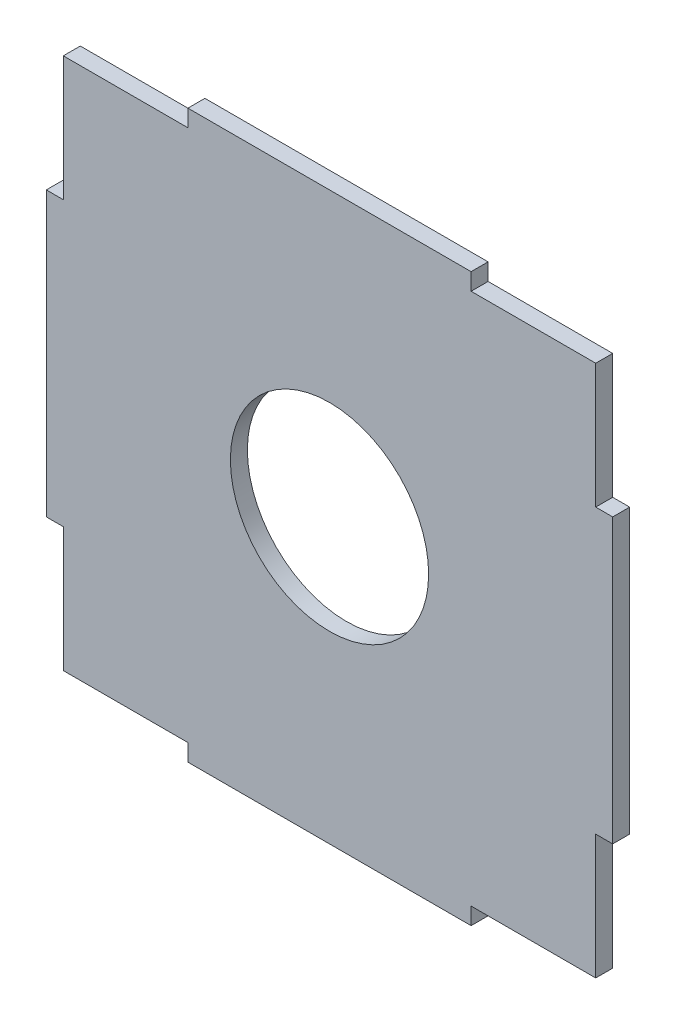
ISO-10303-21;
HEADER;
FILE_DESCRIPTION(('STEP AP214'),'2;1');
FILE_NAME('part.step','',(''),(''),'','','');
FILE_SCHEMA(('AUTOMOTIVE_DESIGN { 1 0 10303 214 1 1 1 1 }'));
ENDSEC;
DATA;
#1=APPLICATION_CONTEXT('core data for automotive mechanical design processes');
#2=APPLICATION_PROTOCOL_DEFINITION('international standard','automotive_design',2000,#1);
#3=PRODUCT_CONTEXT('',#1,'mechanical');
#4=PRODUCT('Part','Part','',(#3));
#5=PRODUCT_RELATED_PRODUCT_CATEGORY('part','',(#4));
#6=PRODUCT_DEFINITION_FORMATION('','',#4);
#7=PRODUCT_DEFINITION_CONTEXT('part definition',#1,'design');
#8=PRODUCT_DEFINITION('design','',#6,#7);
#9=PRODUCT_DEFINITION_SHAPE('','',#8);
#10=(LENGTH_UNIT() NAMED_UNIT(*) SI_UNIT(.MILLI.,.METRE.));
#11=(NAMED_UNIT(*) PLANE_ANGLE_UNIT() SI_UNIT($,.RADIAN.));
#12=(NAMED_UNIT(*) SI_UNIT($,.STERADIAN.) SOLID_ANGLE_UNIT());
#13=UNCERTAINTY_MEASURE_WITH_UNIT(LENGTH_MEASURE(1.E-05),#10,'distance_accuracy_value','');
#14=(GEOMETRIC_REPRESENTATION_CONTEXT(3) GLOBAL_UNCERTAINTY_ASSIGNED_CONTEXT((#13)) GLOBAL_UNIT_ASSIGNED_CONTEXT((#10,
#11,#12)) REPRESENTATION_CONTEXT('',''));
#15=CARTESIAN_POINT('',(0.,0.,0.));
#16=DIRECTION('',(0.,0.,1.));
#17=DIRECTION('',(1.,0.,0.));
#18=AXIS2_PLACEMENT_3D('',#15,#16,#17);
#19=CARTESIAN_POINT('',(-97.,97.,3.));
#20=DIRECTION('',(0.,-1.,0.));
#21=DIRECTION('',(0.,0.,-1.));
#22=AXIS2_PLACEMENT_3D('',#19,#20,#21);
#23=PLANE('',#22);
#24=DIRECTION('',(-1.,0.,0.));
#25=VECTOR('',#24,1.);
#26=CARTESIAN_POINT('',(-97.,97.,0.));
#27=LINE('',#26,#25);
#28=CARTESIAN_POINT('',(-75.,97.,0.));
#29=VERTEX_POINT('',#28);
#30=CARTESIAN_POINT('',(-97.,97.,0.));
#31=VERTEX_POINT('',#30);
#32=EDGE_CURVE('E207',#29,#31,#27,.T.);
#33=ORIENTED_EDGE('',*,*,#32,.T.);
#34=DIRECTION('',(0.,0.,-1.));
#35=VECTOR('',#34,1.);
#36=CARTESIAN_POINT('',(-97.,97.,3.));
#37=LINE('',#36,#35);
#38=CARTESIAN_POINT('',(-97.,97.,3.));
#39=VERTEX_POINT('',#38);
#40=EDGE_CURVE('E11',#39,#31,#37,.T.);
#41=ORIENTED_EDGE('',*,*,#40,.F.);
#42=DIRECTION('',(-1.,0.,0.));
#43=VECTOR('',#42,1.);
#44=CARTESIAN_POINT('',(-97.,97.,3.));
#45=LINE('',#44,#43);
#46=CARTESIAN_POINT('',(-75.,97.,3.));
#47=VERTEX_POINT('',#46);
#48=EDGE_CURVE('E246',#47,#39,#45,.T.);
#49=ORIENTED_EDGE('',*,*,#48,.F.);
#50=DIRECTION('',(0.,0.,-1.));
#51=VECTOR('',#50,1.);
#52=CARTESIAN_POINT('',(-75.,97.,3.));
#53=LINE('',#52,#51);
#54=EDGE_CURVE('E203',#47,#29,#53,.T.);
#55=ORIENTED_EDGE('',*,*,#54,.T.);
#56=EDGE_LOOP('',(#33,#41,#49,#55));
#57=FACE_BOUND('',#56,.T.);
#58=ADVANCED_FACE('F39',(#57),#23,.F.);
#59=CARTESIAN_POINT('',(-97.,97.,3.));
#60=DIRECTION('',(1.,0.,0.));
#61=DIRECTION('',(0.,0.,-1.));
#62=AXIS2_PLACEMENT_3D('',#59,#60,#61);
#63=PLANE('',#62);
#64=DIRECTION('',(0.,-1.,0.));
#65=VECTOR('',#64,1.);
#66=CARTESIAN_POINT('',(-97.,97.,0.));
#67=LINE('',#66,#65);
#68=CARTESIAN_POINT('',(-97.,75.,0.));
#69=VERTEX_POINT('',#68);
#70=EDGE_CURVE('E210',#31,#69,#67,.T.);
#71=ORIENTED_EDGE('',*,*,#70,.T.);
#72=DIRECTION('',(0.,0.,-1.));
#73=VECTOR('',#72,1.);
#74=CARTESIAN_POINT('',(-97.,75.,3.));
#75=LINE('',#74,#73);
#76=CARTESIAN_POINT('',(-97.,75.,3.));
#77=VERTEX_POINT('',#76);
#78=EDGE_CURVE('E47',#77,#69,#75,.T.);
#79=ORIENTED_EDGE('',*,*,#78,.F.);
#80=DIRECTION('',(0.,-1.,0.));
#81=VECTOR('',#80,1.);
#82=CARTESIAN_POINT('',(-97.,97.,3.));
#83=LINE('',#82,#81);
#84=EDGE_CURVE('E134',#39,#77,#83,.T.);
#85=ORIENTED_EDGE('',*,*,#84,.F.);
#86=ORIENTED_EDGE('',*,*,#40,.T.);
#87=EDGE_LOOP('',(#71,#79,#85,#86));
#88=FACE_BOUND('',#87,.T.);
#89=ADVANCED_FACE('F365',(#88),#63,.F.);
#90=CARTESIAN_POINT('',(-100.,75.,3.));
#91=DIRECTION('',(0.,-1.,0.));
#92=DIRECTION('',(0.,0.,-1.));
#93=AXIS2_PLACEMENT_3D('',#90,#91,#92);
#94=PLANE('',#93);
#95=DIRECTION('',(-1.,0.,0.));
#96=VECTOR('',#95,1.);
#97=CARTESIAN_POINT('',(-100.,75.,0.));
#98=LINE('',#97,#96);
#99=CARTESIAN_POINT('',(-100.,75.,0.));
#100=VERTEX_POINT('',#99);
#101=EDGE_CURVE('E213',#69,#100,#98,.T.);
#102=ORIENTED_EDGE('',*,*,#101,.T.);
#103=DIRECTION('',(0.,0.,-1.));
#104=VECTOR('',#103,1.);
#105=CARTESIAN_POINT('',(-100.,75.,3.));
#106=LINE('',#105,#104);
#107=CARTESIAN_POINT('',(-100.,75.,3.));
#108=VERTEX_POINT('',#107);
#109=EDGE_CURVE('E289',#108,#100,#106,.T.);
#110=ORIENTED_EDGE('',*,*,#109,.F.);
#111=DIRECTION('',(-1.,0.,0.));
#112=VECTOR('',#111,1.);
#113=CARTESIAN_POINT('',(-100.,75.,3.));
#114=LINE('',#113,#112);
#115=EDGE_CURVE('E297',#77,#108,#114,.T.);
#116=ORIENTED_EDGE('',*,*,#115,.F.);
#117=ORIENTED_EDGE('',*,*,#78,.T.);
#118=EDGE_LOOP('',(#102,#110,#116,#117));
#119=FACE_BOUND('',#118,.T.);
#120=ADVANCED_FACE('F295',(#119),#94,.F.);
#121=CARTESIAN_POINT('',(-100.,25.,3.));
#122=DIRECTION('',(1.,0.,0.));
#123=DIRECTION('',(0.,0.,-1.));
#124=AXIS2_PLACEMENT_3D('',#121,#122,#123);
#125=PLANE('',#124);
#126=DIRECTION('',(0.,-1.,0.));
#127=VECTOR('',#126,1.);
#128=CARTESIAN_POINT('',(-100.,25.,0.));
#129=LINE('',#128,#127);
#130=CARTESIAN_POINT('',(-100.,25.,0.));
#131=VERTEX_POINT('',#130);
#132=EDGE_CURVE('E215',#100,#131,#129,.T.);
#133=ORIENTED_EDGE('',*,*,#132,.T.);
#134=DIRECTION('',(0.,0.,-1.));
#135=VECTOR('',#134,1.);
#136=CARTESIAN_POINT('',(-100.,25.,3.));
#137=LINE('',#136,#135);
#138=CARTESIAN_POINT('',(-100.,25.,3.));
#139=VERTEX_POINT('',#138);
#140=EDGE_CURVE('E286',#139,#131,#137,.T.);
#141=ORIENTED_EDGE('',*,*,#140,.F.);
#142=DIRECTION('',(0.,-1.,0.));
#143=VECTOR('',#142,1.);
#144=CARTESIAN_POINT('',(-100.,25.,3.));
#145=LINE('',#144,#143);
#146=EDGE_CURVE('E315',#108,#139,#145,.T.);
#147=ORIENTED_EDGE('',*,*,#146,.F.);
#148=ORIENTED_EDGE('',*,*,#109,.T.);
#149=EDGE_LOOP('',(#133,#141,#147,#148));
#150=FACE_BOUND('',#149,.T.);
#151=ADVANCED_FACE('F306',(#150),#125,.F.);
#152=CARTESIAN_POINT('',(-100.,25.,3.));
#153=DIRECTION('',(0.,1.,0.));
#154=DIRECTION('',(-1.,0.,0.));
#155=AXIS2_PLACEMENT_3D('',#152,#153,#154);
#156=PLANE('',#155);
#157=DIRECTION('',(1.,0.,0.));
#158=VECTOR('',#157,1.);
#159=CARTESIAN_POINT('',(-100.,25.,0.));
#160=LINE('',#159,#158);
#161=CARTESIAN_POINT('',(-97.,25.,0.));
#162=VERTEX_POINT('',#161);
#163=EDGE_CURVE('E217',#131,#162,#160,.T.);
#164=ORIENTED_EDGE('',*,*,#163,.T.);
#165=DIRECTION('',(0.,0.,-1.));
#166=VECTOR('',#165,1.);
#167=CARTESIAN_POINT('',(-97.,25.,3.));
#168=LINE('',#167,#166);
#169=CARTESIAN_POINT('',(-97.,25.,3.));
#170=VERTEX_POINT('',#169);
#171=EDGE_CURVE('E283',#170,#162,#168,.T.);
#172=ORIENTED_EDGE('',*,*,#171,.F.);
#173=DIRECTION('',(1.,0.,0.));
#174=VECTOR('',#173,1.);
#175=CARTESIAN_POINT('',(-100.,25.,3.));
#176=LINE('',#175,#174);
#177=EDGE_CURVE('E312',#139,#170,#176,.T.);
#178=ORIENTED_EDGE('',*,*,#177,.F.);
#179=ORIENTED_EDGE('',*,*,#140,.T.);
#180=EDGE_LOOP('',(#164,#172,#178,#179));
#181=FACE_BOUND('',#180,.T.);
#182=ADVANCED_FACE('F310',(#181),#156,.F.);
#183=CARTESIAN_POINT('',(-97.,25.,3.));
#184=DIRECTION('',(1.,0.,0.));
#185=DIRECTION('',(0.,0.,-1.));
#186=AXIS2_PLACEMENT_3D('',#183,#184,#185);
#187=PLANE('',#186);
#188=DIRECTION('',(0.,-1.,0.));
#189=VECTOR('',#188,1.);
#190=CARTESIAN_POINT('',(-97.,25.,0.));
#191=LINE('',#190,#189);
#192=CARTESIAN_POINT('',(-97.,2.99999999999999,0.));
#193=VERTEX_POINT('',#192);
#194=EDGE_CURVE('E219',#162,#193,#191,.T.);
#195=ORIENTED_EDGE('',*,*,#194,.T.);
#196=DIRECTION('',(0.,0.,-1.));
#197=VECTOR('',#196,1.);
#198=CARTESIAN_POINT('',(-97.,2.99999999999999,3.));
#199=LINE('',#198,#197);
#200=CARTESIAN_POINT('',(-97.,2.99999999999999,3.));
#201=VERTEX_POINT('',#200);
#202=EDGE_CURVE('E280',#201,#193,#199,.T.);
#203=ORIENTED_EDGE('',*,*,#202,.F.);
#204=DIRECTION('',(0.,-1.,0.));
#205=VECTOR('',#204,1.);
#206=CARTESIAN_POINT('',(-97.,25.,3.));
#207=LINE('',#206,#205);
#208=EDGE_CURVE('E314',#170,#201,#207,.T.);
#209=ORIENTED_EDGE('',*,*,#208,.F.);
#210=ORIENTED_EDGE('',*,*,#171,.T.);
#211=EDGE_LOOP('',(#195,#203,#209,#210));
#212=FACE_BOUND('',#211,.T.);
#213=ADVANCED_FACE('F378',(#212),#187,.F.);
#214=CARTESIAN_POINT('',(-97.,2.99999999999999,3.));
#215=DIRECTION('',(0.,1.,0.));
#216=DIRECTION('',(-1.,0.,0.));
#217=AXIS2_PLACEMENT_3D('',#214,#215,#216);
#218=PLANE('',#217);
#219=DIRECTION('',(1.,0.,0.));
#220=VECTOR('',#219,1.);
#221=CARTESIAN_POINT('',(-97.,2.99999999999999,0.));
#222=LINE('',#221,#220);
#223=CARTESIAN_POINT('',(-75.,2.99999999999999,0.));
#224=VERTEX_POINT('',#223);
#225=EDGE_CURVE('E221',#193,#224,#222,.T.);
#226=ORIENTED_EDGE('',*,*,#225,.T.);
#227=DIRECTION('',(0.,0.,-1.));
#228=VECTOR('',#227,1.);
#229=CARTESIAN_POINT('',(-75.,2.99999999999999,3.));
#230=LINE('',#229,#228);
#231=CARTESIAN_POINT('',(-75.,2.99999999999999,3.));
#232=VERTEX_POINT('',#231);
#233=EDGE_CURVE('E277',#232,#224,#230,.T.);
#234=ORIENTED_EDGE('',*,*,#233,.F.);
#235=DIRECTION('',(1.,0.,0.));
#236=VECTOR('',#235,1.);
#237=CARTESIAN_POINT('',(-97.,2.99999999999999,3.));
#238=LINE('',#237,#236);
#239=EDGE_CURVE('E317',#201,#232,#238,.T.);
#240=ORIENTED_EDGE('',*,*,#239,.F.);
#241=ORIENTED_EDGE('',*,*,#202,.T.);
#242=EDGE_LOOP('',(#226,#234,#240,#241));
#243=FACE_BOUND('',#242,.T.);
#244=ADVANCED_FACE('F381',(#243),#218,.F.);
#245=CARTESIAN_POINT('',(-75.,2.99999999999999,3.));
#246=DIRECTION('',(1.,0.,0.));
#247=DIRECTION('',(0.,0.,-1.));
#248=AXIS2_PLACEMENT_3D('',#245,#246,#247);
#249=PLANE('',#248);
#250=DIRECTION('',(0.,-1.,0.));
#251=VECTOR('',#250,1.);
#252=CARTESIAN_POINT('',(-75.,2.99999999999999,0.));
#253=LINE('',#252,#251);
#254=CARTESIAN_POINT('',(-75.,0.,0.));
#255=VERTEX_POINT('',#254);
#256=EDGE_CURVE('E223',#224,#255,#253,.T.);
#257=ORIENTED_EDGE('',*,*,#256,.T.);
#258=DIRECTION('',(0.,0.,-1.));
#259=VECTOR('',#258,1.);
#260=CARTESIAN_POINT('',(-75.,0.,3.));
#261=LINE('',#260,#259);
#262=CARTESIAN_POINT('',(-75.,0.,3.));
#263=VERTEX_POINT('',#262);
#264=EDGE_CURVE('E274',#263,#255,#261,.T.);
#265=ORIENTED_EDGE('',*,*,#264,.F.);
#266=DIRECTION('',(0.,-1.,0.));
#267=VECTOR('',#266,1.);
#268=CARTESIAN_POINT('',(-75.,2.99999999999999,3.));
#269=LINE('',#268,#267);
#270=EDGE_CURVE('E323',#232,#263,#269,.T.);
#271=ORIENTED_EDGE('',*,*,#270,.F.);
#272=ORIENTED_EDGE('',*,*,#233,.T.);
#273=EDGE_LOOP('',(#257,#265,#271,#272));
#274=FACE_BOUND('',#273,.T.);
#275=ADVANCED_FACE('F385',(#274),#249,.F.);
#276=CARTESIAN_POINT('',(-25.,0.,3.));
#277=DIRECTION('',(0.,1.,0.));
#278=DIRECTION('',(0.,0.,1.));
#279=AXIS2_PLACEMENT_3D('',#276,#277,#278);
#280=PLANE('',#279);
#281=DIRECTION('',(1.,0.,0.));
#282=VECTOR('',#281,1.);
#283=CARTESIAN_POINT('',(-25.,0.,0.));
#284=LINE('',#283,#282);
#285=CARTESIAN_POINT('',(-25.,0.,0.));
#286=VERTEX_POINT('',#285);
#287=EDGE_CURVE('E225',#255,#286,#284,.T.);
#288=ORIENTED_EDGE('',*,*,#287,.T.);
#289=DIRECTION('',(0.,0.,-1.));
#290=VECTOR('',#289,1.);
#291=CARTESIAN_POINT('',(-25.,0.,3.));
#292=LINE('',#291,#290);
#293=CARTESIAN_POINT('',(-25.,0.,3.));
#294=VERTEX_POINT('',#293);
#295=EDGE_CURVE('E271',#294,#286,#292,.T.);
#296=ORIENTED_EDGE('',*,*,#295,.F.);
#297=DIRECTION('',(1.,0.,0.));
#298=VECTOR('',#297,1.);
#299=CARTESIAN_POINT('',(-25.,0.,3.));
#300=LINE('',#299,#298);
#301=EDGE_CURVE('E325',#263,#294,#300,.T.);
#302=ORIENTED_EDGE('',*,*,#301,.F.);
#303=ORIENTED_EDGE('',*,*,#264,.T.);
#304=EDGE_LOOP('',(#288,#296,#302,#303));
#305=FACE_BOUND('',#304,.T.);
#306=ADVANCED_FACE('F389',(#305),#280,.F.);
#307=CARTESIAN_POINT('',(-25.,2.99999999999999,3.));
#308=DIRECTION('',(-1.,0.,0.));
#309=DIRECTION('',(0.,-1.,0.));
#310=AXIS2_PLACEMENT_3D('',#307,#308,#309);
#311=PLANE('',#310);
#312=DIRECTION('',(0.,1.,0.));
#313=VECTOR('',#312,1.);
#314=CARTESIAN_POINT('',(-25.,2.99999999999999,0.));
#315=LINE('',#314,#313);
#316=CARTESIAN_POINT('',(-25.,2.99999999999999,0.));
#317=VERTEX_POINT('',#316);
#318=EDGE_CURVE('E227',#286,#317,#315,.T.);
#319=ORIENTED_EDGE('',*,*,#318,.T.);
#320=DIRECTION('',(0.,0.,-1.));
#321=VECTOR('',#320,1.);
#322=CARTESIAN_POINT('',(-25.,2.99999999999999,3.));
#323=LINE('',#322,#321);
#324=CARTESIAN_POINT('',(-25.,2.99999999999999,3.));
#325=VERTEX_POINT('',#324);
#326=EDGE_CURVE('E268',#325,#317,#323,.T.);
#327=ORIENTED_EDGE('',*,*,#326,.F.);
#328=DIRECTION('',(0.,1.,0.));
#329=VECTOR('',#328,1.);
#330=CARTESIAN_POINT('',(-25.,2.99999999999999,3.));
#331=LINE('',#330,#329);
#332=EDGE_CURVE('E327',#294,#325,#331,.T.);
#333=ORIENTED_EDGE('',*,*,#332,.F.);
#334=ORIENTED_EDGE('',*,*,#295,.T.);
#335=EDGE_LOOP('',(#319,#327,#333,#334));
#336=FACE_BOUND('',#335,.T.);
#337=ADVANCED_FACE('F393',(#336),#311,.F.);
#338=CARTESIAN_POINT('',(-25.,2.99999999999999,3.));
#339=DIRECTION('',(0.,1.,0.));
#340=DIRECTION('',(-1.,0.,0.));
#341=AXIS2_PLACEMENT_3D('',#338,#339,#340);
#342=PLANE('',#341);
#343=DIRECTION('',(1.,0.,0.));
#344=VECTOR('',#343,1.);
#345=CARTESIAN_POINT('',(-25.,2.99999999999999,0.));
#346=LINE('',#345,#344);
#347=CARTESIAN_POINT('',(-2.99999999999999,2.99999999999999,0.));
#348=VERTEX_POINT('',#347);
#349=EDGE_CURVE('E229',#317,#348,#346,.T.);
#350=ORIENTED_EDGE('',*,*,#349,.T.);
#351=DIRECTION('',(0.,0.,-1.));
#352=VECTOR('',#351,1.);
#353=CARTESIAN_POINT('',(-2.99999999999999,2.99999999999999,3.));
#354=LINE('',#353,#352);
#355=CARTESIAN_POINT('',(-2.99999999999999,2.99999999999999,3.));
#356=VERTEX_POINT('',#355);
#357=EDGE_CURVE('E265',#356,#348,#354,.T.);
#358=ORIENTED_EDGE('',*,*,#357,.F.);
#359=DIRECTION('',(1.,0.,0.));
#360=VECTOR('',#359,1.);
#361=CARTESIAN_POINT('',(-25.,2.99999999999999,3.));
#362=LINE('',#361,#360);
#363=EDGE_CURVE('E329',#325,#356,#362,.T.);
#364=ORIENTED_EDGE('',*,*,#363,.F.);
#365=ORIENTED_EDGE('',*,*,#326,.T.);
#366=EDGE_LOOP('',(#350,#358,#364,#365));
#367=FACE_BOUND('',#366,.T.);
#368=ADVANCED_FACE('F397',(#367),#342,.F.);
#369=CARTESIAN_POINT('',(-2.99999999999999,25.,3.));
#370=DIRECTION('',(-1.,0.,0.));
#371=DIRECTION('',(0.,-1.,0.));
#372=AXIS2_PLACEMENT_3D('',#369,#370,#371);
#373=PLANE('',#372);
#374=DIRECTION('',(0.,1.,0.));
#375=VECTOR('',#374,1.);
#376=CARTESIAN_POINT('',(-2.99999999999999,25.,0.));
#377=LINE('',#376,#375);
#378=CARTESIAN_POINT('',(-2.99999999999999,25.,0.));
#379=VERTEX_POINT('',#378);
#380=EDGE_CURVE('E231',#348,#379,#377,.T.);
#381=ORIENTED_EDGE('',*,*,#380,.T.);
#382=DIRECTION('',(0.,0.,-1.));
#383=VECTOR('',#382,1.);
#384=CARTESIAN_POINT('',(-2.99999999999999,25.,3.));
#385=LINE('',#384,#383);
#386=CARTESIAN_POINT('',(-2.99999999999999,25.,3.));
#387=VERTEX_POINT('',#386);
#388=EDGE_CURVE('E262',#387,#379,#385,.T.);
#389=ORIENTED_EDGE('',*,*,#388,.F.);
#390=DIRECTION('',(0.,1.,0.));
#391=VECTOR('',#390,1.);
#392=CARTESIAN_POINT('',(-2.99999999999999,25.,3.));
#393=LINE('',#392,#391);
#394=EDGE_CURVE('E331',#356,#387,#393,.T.);
#395=ORIENTED_EDGE('',*,*,#394,.F.);
#396=ORIENTED_EDGE('',*,*,#357,.T.);
#397=EDGE_LOOP('',(#381,#389,#395,#396));
#398=FACE_BOUND('',#397,.T.);
#399=ADVANCED_FACE('F401',(#398),#373,.F.);
#400=CARTESIAN_POINT('',(-2.99999999999999,25.,3.));
#401=DIRECTION('',(0.,1.,0.));
#402=DIRECTION('',(-1.,0.,0.));
#403=AXIS2_PLACEMENT_3D('',#400,#401,#402);
#404=PLANE('',#403);
#405=DIRECTION('',(1.,0.,0.));
#406=VECTOR('',#405,1.);
#407=CARTESIAN_POINT('',(-2.99999999999999,25.,0.));
#408=LINE('',#407,#406);
#409=CARTESIAN_POINT('',(0.,25.,0.));
#410=VERTEX_POINT('',#409);
#411=EDGE_CURVE('E233',#379,#410,#408,.T.);
#412=ORIENTED_EDGE('',*,*,#411,.T.);
#413=DIRECTION('',(0.,0.,-1.));
#414=VECTOR('',#413,1.);
#415=CARTESIAN_POINT('',(0.,25.,3.));
#416=LINE('',#415,#414);
#417=CARTESIAN_POINT('',(0.,25.,3.));
#418=VERTEX_POINT('',#417);
#419=EDGE_CURVE('E259',#418,#410,#416,.T.);
#420=ORIENTED_EDGE('',*,*,#419,.F.);
#421=DIRECTION('',(1.,0.,0.));
#422=VECTOR('',#421,1.);
#423=CARTESIAN_POINT('',(-2.99999999999999,25.,3.));
#424=LINE('',#423,#422);
#425=EDGE_CURVE('E333',#387,#418,#424,.T.);
#426=ORIENTED_EDGE('',*,*,#425,.F.);
#427=ORIENTED_EDGE('',*,*,#388,.T.);
#428=EDGE_LOOP('',(#412,#420,#426,#427));
#429=FACE_BOUND('',#428,.T.);
#430=ADVANCED_FACE('F405',(#429),#404,.F.);
#431=CARTESIAN_POINT('',(0.,25.,3.));
#432=DIRECTION('',(-1.,0.,0.));
#433=DIRECTION('',(0.,0.,1.));
#434=AXIS2_PLACEMENT_3D('',#431,#432,#433);
#435=PLANE('',#434);
#436=DIRECTION('',(0.,1.,0.));
#437=VECTOR('',#436,1.);
#438=CARTESIAN_POINT('',(0.,25.,0.));
#439=LINE('',#438,#437);
#440=CARTESIAN_POINT('',(0.,75.,0.));
#441=VERTEX_POINT('',#440);
#442=EDGE_CURVE('E235',#410,#441,#439,.T.);
#443=ORIENTED_EDGE('',*,*,#442,.T.);
#444=DIRECTION('',(0.,0.,-1.));
#445=VECTOR('',#444,1.);
#446=CARTESIAN_POINT('',(0.,75.,3.));
#447=LINE('',#446,#445);
#448=CARTESIAN_POINT('',(0.,75.,3.));
#449=VERTEX_POINT('',#448);
#450=EDGE_CURVE('E256',#449,#441,#447,.T.);
#451=ORIENTED_EDGE('',*,*,#450,.F.);
#452=DIRECTION('',(0.,1.,0.));
#453=VECTOR('',#452,1.);
#454=CARTESIAN_POINT('',(0.,25.,3.));
#455=LINE('',#454,#453);
#456=EDGE_CURVE('E335',#418,#449,#455,.T.);
#457=ORIENTED_EDGE('',*,*,#456,.F.);
#458=ORIENTED_EDGE('',*,*,#419,.T.);
#459=EDGE_LOOP('',(#443,#451,#457,#458));
#460=FACE_BOUND('',#459,.T.);
#461=ADVANCED_FACE('F409',(#460),#435,.F.);
#462=CARTESIAN_POINT('',(-3.,75.,3.));
#463=DIRECTION('',(0.,-1.,0.));
#464=DIRECTION('',(0.,0.,-1.));
#465=AXIS2_PLACEMENT_3D('',#462,#463,#464);
#466=PLANE('',#465);
#467=DIRECTION('',(-1.,0.,0.));
#468=VECTOR('',#467,1.);
#469=CARTESIAN_POINT('',(-3.,75.,0.));
#470=LINE('',#469,#468);
#471=CARTESIAN_POINT('',(-3.,75.,0.));
#472=VERTEX_POINT('',#471);
#473=EDGE_CURVE('E237',#441,#472,#470,.T.);
#474=ORIENTED_EDGE('',*,*,#473,.T.);
#475=DIRECTION('',(0.,0.,-1.));
#476=VECTOR('',#475,1.);
#477=CARTESIAN_POINT('',(-3.,75.,3.));
#478=LINE('',#477,#476);
#479=CARTESIAN_POINT('',(-3.,75.,3.));
#480=VERTEX_POINT('',#479);
#481=EDGE_CURVE('E253',#480,#472,#478,.T.);
#482=ORIENTED_EDGE('',*,*,#481,.F.);
#483=DIRECTION('',(-1.,0.,0.));
#484=VECTOR('',#483,1.);
#485=CARTESIAN_POINT('',(-3.,75.,3.));
#486=LINE('',#485,#484);
#487=EDGE_CURVE('E337',#449,#480,#486,.T.);
#488=ORIENTED_EDGE('',*,*,#487,.F.);
#489=ORIENTED_EDGE('',*,*,#450,.T.);
#490=EDGE_LOOP('',(#474,#482,#488,#489));
#491=FACE_BOUND('',#490,.T.);
#492=ADVANCED_FACE('F413',(#491),#466,.F.);
#493=CARTESIAN_POINT('',(-3.,97.,3.));
#494=DIRECTION('',(-1.,0.,0.));
#495=DIRECTION('',(0.,-1.,0.));
#496=AXIS2_PLACEMENT_3D('',#493,#494,#495);
#497=PLANE('',#496);
#498=DIRECTION('',(0.,1.,0.));
#499=VECTOR('',#498,1.);
#500=CARTESIAN_POINT('',(-3.,97.,0.));
#501=LINE('',#500,#499);
#502=CARTESIAN_POINT('',(-3.,97.,0.));
#503=VERTEX_POINT('',#502);
#504=EDGE_CURVE('E239',#472,#503,#501,.T.);
#505=ORIENTED_EDGE('',*,*,#504,.T.);
#506=DIRECTION('',(0.,0.,-1.));
#507=VECTOR('',#506,1.);
#508=CARTESIAN_POINT('',(-3.,97.,3.));
#509=LINE('',#508,#507);
#510=CARTESIAN_POINT('',(-3.,97.,3.));
#511=VERTEX_POINT('',#510);
#512=EDGE_CURVE('E250',#511,#503,#509,.T.);
#513=ORIENTED_EDGE('',*,*,#512,.F.);
#514=DIRECTION('',(0.,1.,0.));
#515=VECTOR('',#514,1.);
#516=CARTESIAN_POINT('',(-3.,97.,3.));
#517=LINE('',#516,#515);
#518=EDGE_CURVE('E339',#480,#511,#517,.T.);
#519=ORIENTED_EDGE('',*,*,#518,.F.);
#520=ORIENTED_EDGE('',*,*,#481,.T.);
#521=EDGE_LOOP('',(#505,#513,#519,#520));
#522=FACE_BOUND('',#521,.T.);
#523=ADVANCED_FACE('F345',(#522),#497,.F.);
#524=CARTESIAN_POINT('',(-25.,97.,3.));
#525=DIRECTION('',(0.,-1.,0.));
#526=DIRECTION('',(0.,0.,-1.));
#527=AXIS2_PLACEMENT_3D('',#524,#525,#526);
#528=PLANE('',#527);
#529=DIRECTION('',(-1.,0.,0.));
#530=VECTOR('',#529,1.);
#531=CARTESIAN_POINT('',(-25.,97.,0.));
#532=LINE('',#531,#530);
#533=CARTESIAN_POINT('',(-25.,97.,0.));
#534=VERTEX_POINT('',#533);
#535=EDGE_CURVE('E241',#503,#534,#532,.T.);
#536=ORIENTED_EDGE('',*,*,#535,.T.);
#537=DIRECTION('',(0.,0.,-1.));
#538=VECTOR('',#537,1.);
#539=CARTESIAN_POINT('',(-25.,97.,3.));
#540=LINE('',#539,#538);
#541=CARTESIAN_POINT('',(-25.,97.,3.));
#542=VERTEX_POINT('',#541);
#543=EDGE_CURVE('E198',#542,#534,#540,.T.);
#544=ORIENTED_EDGE('',*,*,#543,.F.);
#545=DIRECTION('',(-1.,0.,0.));
#546=VECTOR('',#545,1.);
#547=CARTESIAN_POINT('',(-25.,97.,3.));
#548=LINE('',#547,#546);
#549=EDGE_CURVE('E189',#511,#542,#548,.T.);
#550=ORIENTED_EDGE('',*,*,#549,.F.);
#551=ORIENTED_EDGE('',*,*,#512,.T.);
#552=EDGE_LOOP('',(#536,#544,#550,#551));
#553=FACE_BOUND('',#552,.T.);
#554=ADVANCED_FACE('F349',(#553),#528,.F.);
#555=CARTESIAN_POINT('',(-25.,100.,3.));
#556=DIRECTION('',(-1.,0.,0.));
#557=DIRECTION('',(0.,-1.,0.));
#558=AXIS2_PLACEMENT_3D('',#555,#556,#557);
#559=PLANE('',#558);
#560=DIRECTION('',(0.,1.,0.));
#561=VECTOR('',#560,1.);
#562=CARTESIAN_POINT('',(-25.,100.,0.));
#563=LINE('',#562,#561);
#564=CARTESIAN_POINT('',(-25.,100.,0.));
#565=VERTEX_POINT('',#564);
#566=EDGE_CURVE('E197',#534,#565,#563,.T.);
#567=ORIENTED_EDGE('',*,*,#566,.T.);
#568=DIRECTION('',(0.,0.,-1.));
#569=VECTOR('',#568,1.);
#570=CARTESIAN_POINT('',(-25.,100.,3.));
#571=LINE('',#570,#569);
#572=CARTESIAN_POINT('',(-25.,100.,3.));
#573=VERTEX_POINT('',#572);
#574=EDGE_CURVE('E194',#573,#565,#571,.T.);
#575=ORIENTED_EDGE('',*,*,#574,.F.);
#576=DIRECTION('',(0.,1.,0.));
#577=VECTOR('',#576,1.);
#578=CARTESIAN_POINT('',(-25.,100.,3.));
#579=LINE('',#578,#577);
#580=EDGE_CURVE('E183',#542,#573,#579,.T.);
#581=ORIENTED_EDGE('',*,*,#580,.F.);
#582=ORIENTED_EDGE('',*,*,#543,.T.);
#583=EDGE_LOOP('',(#567,#575,#581,#582));
#584=FACE_BOUND('',#583,.T.);
#585=ADVANCED_FACE('F195',(#584),#559,.F.);
#586=CARTESIAN_POINT('',(-25.,100.,3.));
#587=DIRECTION('',(0.,-1.,0.));
#588=DIRECTION('',(0.,0.,-1.));
#589=AXIS2_PLACEMENT_3D('',#586,#587,#588);
#590=PLANE('',#589);
#591=DIRECTION('',(-1.,0.,0.));
#592=VECTOR('',#591,1.);
#593=CARTESIAN_POINT('',(-25.,100.,0.));
#594=LINE('',#593,#592);
#595=CARTESIAN_POINT('',(-75.,100.,0.));
#596=VERTEX_POINT('',#595);
#597=EDGE_CURVE('E120',#565,#596,#594,.T.);
#598=ORIENTED_EDGE('',*,*,#597,.T.);
#599=DIRECTION('',(0.,0.,-1.));
#600=VECTOR('',#599,1.);
#601=CARTESIAN_POINT('',(-75.,100.,3.));
#602=LINE('',#601,#600);
#603=CARTESIAN_POINT('',(-75.,100.,3.));
#604=VERTEX_POINT('',#603);
#605=EDGE_CURVE('E199',#604,#596,#602,.T.);
#606=ORIENTED_EDGE('',*,*,#605,.F.);
#607=DIRECTION('',(-1.,0.,0.));
#608=VECTOR('',#607,1.);
#609=CARTESIAN_POINT('',(-25.,100.,3.));
#610=LINE('',#609,#608);
#611=EDGE_CURVE('E187',#573,#604,#610,.T.);
#612=ORIENTED_EDGE('',*,*,#611,.F.);
#613=ORIENTED_EDGE('',*,*,#574,.T.);
#614=EDGE_LOOP('',(#598,#606,#612,#613));
#615=FACE_BOUND('',#614,.T.);
#616=ADVANCED_FACE('F201',(#615),#590,.F.);
#617=CARTESIAN_POINT('',(-75.,100.,3.));
#618=DIRECTION('',(1.,0.,0.));
#619=DIRECTION('',(0.,0.,-1.));
#620=AXIS2_PLACEMENT_3D('',#617,#618,#619);
#621=PLANE('',#620);
#622=DIRECTION('',(0.,-1.,0.));
#623=VECTOR('',#622,1.);
#624=CARTESIAN_POINT('',(-75.,100.,0.));
#625=LINE('',#624,#623);
#626=EDGE_CURVE('E126',#596,#29,#625,.T.);
#627=ORIENTED_EDGE('',*,*,#626,.T.);
#628=ORIENTED_EDGE('',*,*,#54,.F.);
#629=DIRECTION('',(0.,-1.,0.));
#630=VECTOR('',#629,1.);
#631=CARTESIAN_POINT('',(-75.,100.,3.));
#632=LINE('',#631,#630);
#633=EDGE_CURVE('E55',#604,#47,#632,.T.);
#634=ORIENTED_EDGE('',*,*,#633,.F.);
#635=ORIENTED_EDGE('',*,*,#605,.T.);
#636=EDGE_LOOP('',(#627,#628,#634,#635));
#637=FACE_BOUND('',#636,.T.);
#638=ADVANCED_FACE('F353',(#637),#621,.F.);
#639=CARTESIAN_POINT('',(0.,0.,3.));
#640=DIRECTION('',(0.,0.,-1.));
#641=DIRECTION('',(-1.,0.,0.));
#642=AXIS2_PLACEMENT_3D('',#639,#640,#641);
#643=PLANE('',#642);
#644=CARTESIAN_POINT('',(-50.,50.,3.));
#645=DIRECTION('',(0.,0.,-1.));
#646=DIRECTION('',(-1.,0.,0.));
#647=AXIS2_PLACEMENT_3D('',#644,#645,#646);
#648=CIRCLE('',#647,17.5);
#649=CARTESIAN_POINT('',(-67.5,50.,3.));
#650=VERTEX_POINT('',#649);
#651=EDGE_CURVE('E211',#650,#650,#648,.T.);
#652=ORIENTED_EDGE('',*,*,#651,.T.);
#653=EDGE_LOOP('',(#652));
#654=FACE_BOUND('',#653,.T.);
#655=ORIENTED_EDGE('',*,*,#48,.T.);
#656=ORIENTED_EDGE('',*,*,#84,.T.);
#657=ORIENTED_EDGE('',*,*,#115,.T.);
#658=ORIENTED_EDGE('',*,*,#146,.T.);
#659=ORIENTED_EDGE('',*,*,#177,.T.);
#660=ORIENTED_EDGE('',*,*,#208,.T.);
#661=ORIENTED_EDGE('',*,*,#239,.T.);
#662=ORIENTED_EDGE('',*,*,#270,.T.);
#663=ORIENTED_EDGE('',*,*,#301,.T.);
#664=ORIENTED_EDGE('',*,*,#332,.T.);
#665=ORIENTED_EDGE('',*,*,#363,.T.);
#666=ORIENTED_EDGE('',*,*,#394,.T.);
#667=ORIENTED_EDGE('',*,*,#425,.T.);
#668=ORIENTED_EDGE('',*,*,#456,.T.);
#669=ORIENTED_EDGE('',*,*,#487,.T.);
#670=ORIENTED_EDGE('',*,*,#518,.T.);
#671=ORIENTED_EDGE('',*,*,#549,.T.);
#672=ORIENTED_EDGE('',*,*,#580,.T.);
#673=ORIENTED_EDGE('',*,*,#611,.T.);
#674=ORIENTED_EDGE('',*,*,#633,.T.);
#675=EDGE_LOOP('',(#655,#656,#657,#658,#659,#660,#661,#662,#663,#664,#665,#666,#667,#668,#669,
#670,#671,#672,#673,#674));
#676=FACE_BOUND('',#675,.T.);
#677=ADVANCED_FACE('F185',(#654,#676),#643,.F.);
#678=CARTESIAN_POINT('',(0.,0.,0.));
#679=DIRECTION('',(0.,0.,-1.));
#680=DIRECTION('',(-1.,0.,0.));
#681=AXIS2_PLACEMENT_3D('',#678,#679,#680);
#682=PLANE('',#681);
#683=CARTESIAN_POINT('',(-50.,50.,0.));
#684=DIRECTION('',(0.,0.,-1.));
#685=DIRECTION('',(-1.,0.,0.));
#686=AXIS2_PLACEMENT_3D('',#683,#684,#685);
#687=CIRCLE('',#686,17.5);
#688=CARTESIAN_POINT('',(-67.5,50.,0.));
#689=VERTEX_POINT('',#688);
#690=EDGE_CURVE('E468',#689,#689,#687,.T.);
#691=ORIENTED_EDGE('',*,*,#690,.F.);
#692=EDGE_LOOP('',(#691));
#693=FACE_BOUND('',#692,.T.);
#694=ORIENTED_EDGE('',*,*,#32,.F.);
#695=ORIENTED_EDGE('',*,*,#626,.F.);
#696=ORIENTED_EDGE('',*,*,#597,.F.);
#697=ORIENTED_EDGE('',*,*,#566,.F.);
#698=ORIENTED_EDGE('',*,*,#535,.F.);
#699=ORIENTED_EDGE('',*,*,#504,.F.);
#700=ORIENTED_EDGE('',*,*,#473,.F.);
#701=ORIENTED_EDGE('',*,*,#442,.F.);
#702=ORIENTED_EDGE('',*,*,#411,.F.);
#703=ORIENTED_EDGE('',*,*,#380,.F.);
#704=ORIENTED_EDGE('',*,*,#349,.F.);
#705=ORIENTED_EDGE('',*,*,#318,.F.);
#706=ORIENTED_EDGE('',*,*,#287,.F.);
#707=ORIENTED_EDGE('',*,*,#256,.F.);
#708=ORIENTED_EDGE('',*,*,#225,.F.);
#709=ORIENTED_EDGE('',*,*,#194,.F.);
#710=ORIENTED_EDGE('',*,*,#163,.F.);
#711=ORIENTED_EDGE('',*,*,#132,.F.);
#712=ORIENTED_EDGE('',*,*,#101,.F.);
#713=ORIENTED_EDGE('',*,*,#70,.F.);
#714=EDGE_LOOP('',(#694,#695,#696,#697,#698,#699,#700,#701,#702,#703,#704,#705,#706,#707,#708,
#709,#710,#711,#712,#713));
#715=FACE_BOUND('',#714,.T.);
#716=ADVANCED_FACE('F301',(#693,#715),#682,.T.);
#717=CARTESIAN_POINT('',(-50.,50.,3.));
#718=DIRECTION('',(0.,0.,-1.));
#719=DIRECTION('',(-1.,0.,0.));
#720=AXIS2_PLACEMENT_3D('',#717,#718,#719);
#721=CYLINDRICAL_SURFACE('',#720,17.5);
#722=ORIENTED_EDGE('',*,*,#651,.F.);
#723=EDGE_LOOP('',(#722));
#724=FACE_BOUND('',#723,.T.);
#725=ORIENTED_EDGE('',*,*,#690,.T.);
#726=EDGE_LOOP('',(#725));
#727=FACE_BOUND('',#726,.T.);
#728=ADVANCED_FACE('F450',(#724,#727),#721,.F.);
#729=CLOSED_SHELL('',(#58,#89,#120,#151,#182,#213,#244,#275,#306,#337,#368,#399,#430,#461,#492,
#523,#554,#585,#616,#638,#677,#716,#728));
#730=MANIFOLD_SOLID_BREP('B2',#729);
#731=ADVANCED_BREP_SHAPE_REPRESENTATION('',(#18,#730),#14);
#732=SHAPE_DEFINITION_REPRESENTATION(#9,#731);
ENDSEC;
END-ISO-10303-21;
